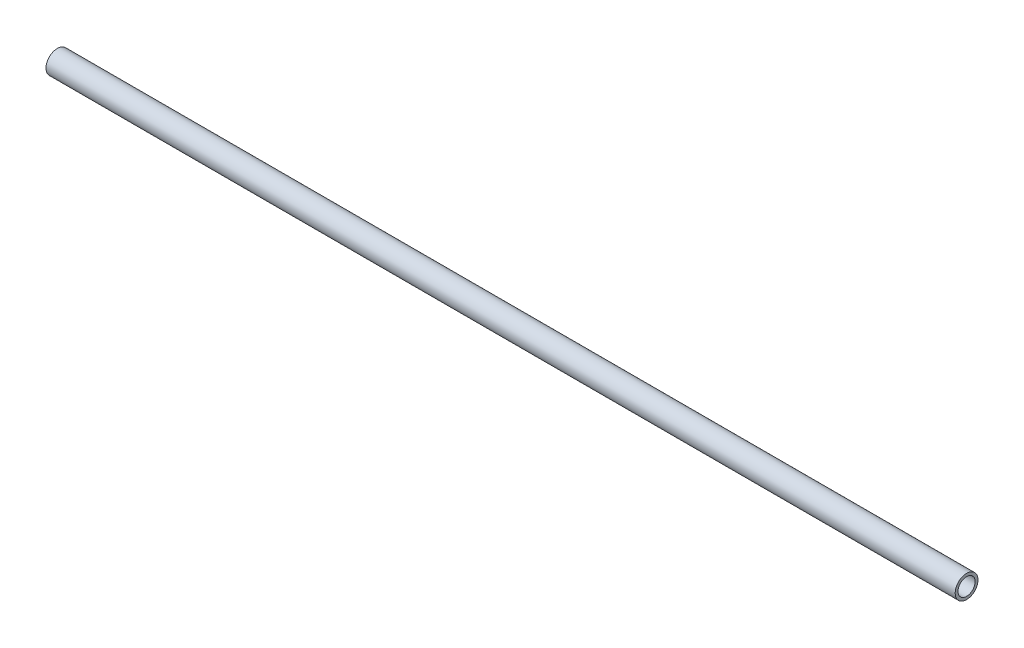
ISO-10303-21;
HEADER;
FILE_DESCRIPTION(('STEP AP214'),'2;1');
FILE_NAME('part.step','',(''),(''),'','','');
FILE_SCHEMA(('AUTOMOTIVE_DESIGN { 1 0 10303 214 1 1 1 1 }'));
ENDSEC;
DATA;
#1=APPLICATION_CONTEXT('core data for automotive mechanical design processes');
#2=APPLICATION_PROTOCOL_DEFINITION('international standard','automotive_design',2000,#1);
#3=PRODUCT_CONTEXT('',#1,'mechanical');
#4=PRODUCT('Part','Part','',(#3));
#5=PRODUCT_RELATED_PRODUCT_CATEGORY('part','',(#4));
#6=PRODUCT_DEFINITION_FORMATION('','',#4);
#7=PRODUCT_DEFINITION_CONTEXT('part definition',#1,'design');
#8=PRODUCT_DEFINITION('design','',#6,#7);
#9=PRODUCT_DEFINITION_SHAPE('','',#8);
#10=(LENGTH_UNIT() NAMED_UNIT(*) SI_UNIT(.MILLI.,.METRE.));
#11=(NAMED_UNIT(*) PLANE_ANGLE_UNIT() SI_UNIT($,.RADIAN.));
#12=(NAMED_UNIT(*) SI_UNIT($,.STERADIAN.) SOLID_ANGLE_UNIT());
#13=UNCERTAINTY_MEASURE_WITH_UNIT(LENGTH_MEASURE(1.E-05),#10,'distance_accuracy_value','');
#14=(GEOMETRIC_REPRESENTATION_CONTEXT(3) GLOBAL_UNCERTAINTY_ASSIGNED_CONTEXT((#13)) GLOBAL_UNIT_ASSIGNED_CONTEXT((#10,
#11,#12)) REPRESENTATION_CONTEXT('',''));
#15=CARTESIAN_POINT('',(0.,0.,0.));
#16=DIRECTION('',(0.,0.,1.));
#17=DIRECTION('',(1.,0.,0.));
#18=AXIS2_PLACEMENT_3D('',#15,#16,#17);
#19=CARTESIAN_POINT('',(638.,0.,0.));
#20=DIRECTION('',(1.,0.,0.));
#21=DIRECTION('',(0.,0.,-1.));
#22=AXIS2_PLACEMENT_3D('',#19,#20,#21);
#23=PLANE('',#22);
#24=CARTESIAN_POINT('',(638.,0.,0.));
#25=DIRECTION('',(1.,0.,0.));
#26=DIRECTION('',(0.,0.,-1.));
#27=AXIS2_PLACEMENT_3D('',#24,#25,#26);
#28=CIRCLE('',#27,8.);
#29=CARTESIAN_POINT('',(638.,0.,-8.));
#30=VERTEX_POINT('',#29);
#31=EDGE_CURVE('E12',#30,#30,#28,.T.);
#32=ORIENTED_EDGE('',*,*,#31,.T.);
#33=EDGE_LOOP('',(#32));
#34=FACE_BOUND('',#33,.T.);
#35=CARTESIAN_POINT('',(638.,0.,0.));
#36=DIRECTION('',(1.,0.,0.));
#37=DIRECTION('',(0.,0.,-1.));
#38=AXIS2_PLACEMENT_3D('',#35,#36,#37);
#39=CIRCLE('',#38,6.);
#40=CARTESIAN_POINT('',(638.,0.,-6.));
#41=VERTEX_POINT('',#40);
#42=EDGE_CURVE('E52',#41,#41,#39,.T.);
#43=ORIENTED_EDGE('',*,*,#42,.F.);
#44=EDGE_LOOP('',(#43));
#45=FACE_BOUND('',#44,.T.);
#46=ADVANCED_FACE('F41',(#34,#45),#23,.T.);
#47=CARTESIAN_POINT('',(0.,0.,0.));
#48=DIRECTION('',(1.,0.,0.));
#49=DIRECTION('',(0.,0.,-1.));
#50=AXIS2_PLACEMENT_3D('',#47,#48,#49);
#51=PLANE('',#50);
#52=CARTESIAN_POINT('',(0.,0.,0.));
#53=DIRECTION('',(1.,0.,0.));
#54=DIRECTION('',(0.,0.,-1.));
#55=AXIS2_PLACEMENT_3D('',#52,#53,#54);
#56=CIRCLE('',#55,8.);
#57=CARTESIAN_POINT('',(0.,0.,-8.));
#58=VERTEX_POINT('',#57);
#59=EDGE_CURVE('E45',#58,#58,#56,.T.);
#60=ORIENTED_EDGE('',*,*,#59,.F.);
#61=EDGE_LOOP('',(#60));
#62=FACE_BOUND('',#61,.T.);
#63=CARTESIAN_POINT('',(0.,0.,0.));
#64=DIRECTION('',(1.,0.,0.));
#65=DIRECTION('',(0.,0.,-1.));
#66=AXIS2_PLACEMENT_3D('',#63,#64,#65);
#67=CIRCLE('',#66,6.);
#68=CARTESIAN_POINT('',(0.,0.,-6.));
#69=VERTEX_POINT('',#68);
#70=EDGE_CURVE('E54',#69,#69,#67,.T.);
#71=ORIENTED_EDGE('',*,*,#70,.T.);
#72=EDGE_LOOP('',(#71));
#73=FACE_BOUND('',#72,.T.);
#74=ADVANCED_FACE('F64',(#62,#73),#51,.F.);
#75=CARTESIAN_POINT('',(638.,0.,0.));
#76=DIRECTION('',(-1.,0.,0.));
#77=DIRECTION('',(0.,0.,1.));
#78=AXIS2_PLACEMENT_3D('',#75,#76,#77);
#79=CYLINDRICAL_SURFACE('',#78,8.);
#80=ORIENTED_EDGE('',*,*,#31,.F.);
#81=EDGE_LOOP('',(#80));
#82=FACE_BOUND('',#81,.T.);
#83=ORIENTED_EDGE('',*,*,#59,.T.);
#84=EDGE_LOOP('',(#83));
#85=FACE_BOUND('',#84,.T.);
#86=ADVANCED_FACE('F43',(#82,#85),#79,.T.);
#87=CARTESIAN_POINT('',(638.,0.,0.));
#88=DIRECTION('',(-1.,0.,0.));
#89=DIRECTION('',(0.,0.,1.));
#90=AXIS2_PLACEMENT_3D('',#87,#88,#89);
#91=CYLINDRICAL_SURFACE('',#90,6.);
#92=ORIENTED_EDGE('',*,*,#42,.T.);
#93=EDGE_LOOP('',(#92));
#94=FACE_BOUND('',#93,.T.);
#95=ORIENTED_EDGE('',*,*,#70,.F.);
#96=EDGE_LOOP('',(#95));
#97=FACE_BOUND('',#96,.T.);
#98=ADVANCED_FACE('F60',(#94,#97),#91,.F.);
#99=CLOSED_SHELL('',(#46,#74,#86,#98));
#100=MANIFOLD_SOLID_BREP('B2',#99);
#101=ADVANCED_BREP_SHAPE_REPRESENTATION('',(#18,#100),#14);
#102=SHAPE_DEFINITION_REPRESENTATION(#9,#101);
ENDSEC;
END-ISO-10303-21;
